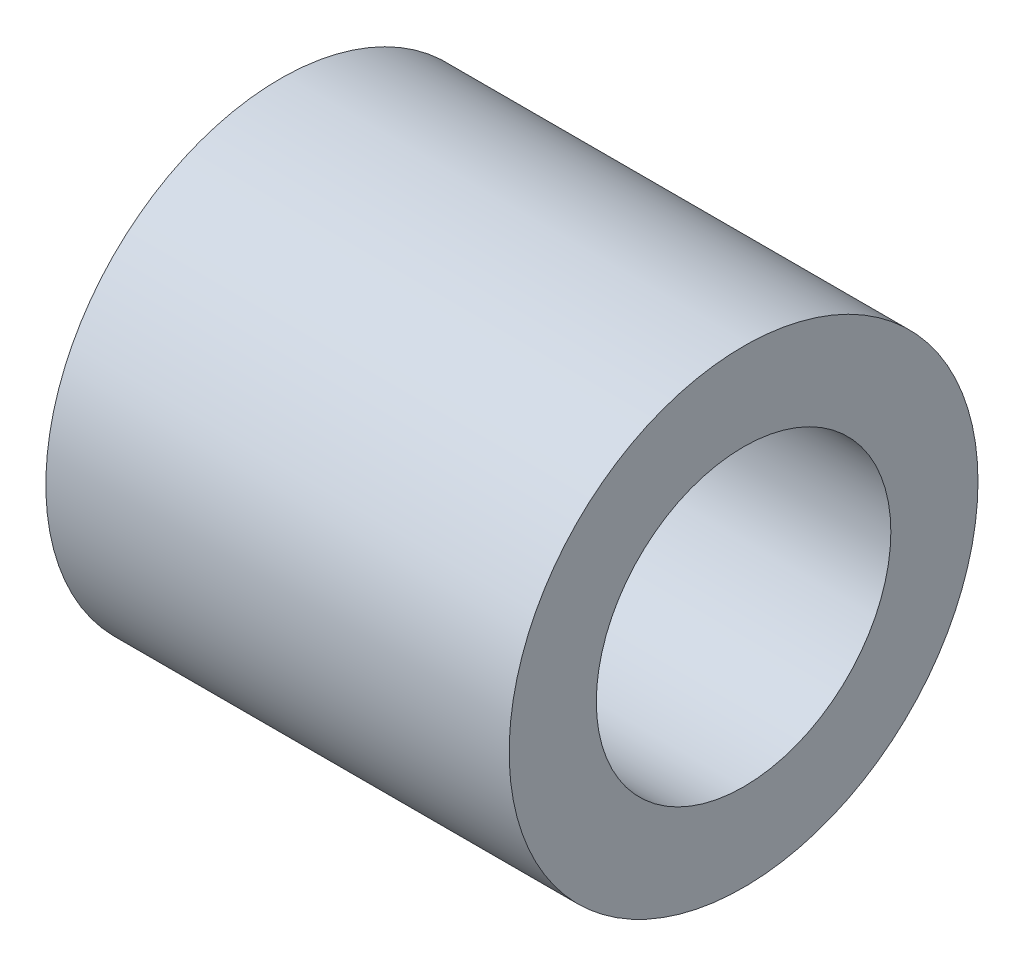
ISO-10303-21;
HEADER;
FILE_DESCRIPTION(('STEP AP214'),'2;1');
FILE_NAME('part.step','',(''),(''),'','','');
FILE_SCHEMA(('AUTOMOTIVE_DESIGN { 1 0 10303 214 1 1 1 1 }'));
ENDSEC;
DATA;
#1=APPLICATION_CONTEXT('core data for automotive mechanical design processes');
#2=APPLICATION_PROTOCOL_DEFINITION('international standard','automotive_design',2000,#1);
#3=PRODUCT_CONTEXT('',#1,'mechanical');
#4=PRODUCT('Part','Part','',(#3));
#5=PRODUCT_RELATED_PRODUCT_CATEGORY('part','',(#4));
#6=PRODUCT_DEFINITION_FORMATION('','',#4);
#7=PRODUCT_DEFINITION_CONTEXT('part definition',#1,'design');
#8=PRODUCT_DEFINITION('design','',#6,#7);
#9=PRODUCT_DEFINITION_SHAPE('','',#8);
#10=(LENGTH_UNIT() NAMED_UNIT(*) SI_UNIT(.MILLI.,.METRE.));
#11=(NAMED_UNIT(*) PLANE_ANGLE_UNIT() SI_UNIT($,.RADIAN.));
#12=(NAMED_UNIT(*) SI_UNIT($,.STERADIAN.) SOLID_ANGLE_UNIT());
#13=UNCERTAINTY_MEASURE_WITH_UNIT(LENGTH_MEASURE(1.E-05),#10,'distance_accuracy_value','');
#14=(GEOMETRIC_REPRESENTATION_CONTEXT(3) GLOBAL_UNCERTAINTY_ASSIGNED_CONTEXT((#13)) GLOBAL_UNIT_ASSIGNED_CONTEXT((#10,
#11,#12)) REPRESENTATION_CONTEXT('',''));
#15=CARTESIAN_POINT('',(0.,0.,0.));
#16=DIRECTION('',(0.,0.,1.));
#17=DIRECTION('',(1.,0.,0.));
#18=AXIS2_PLACEMENT_3D('',#15,#16,#17);
#19=CARTESIAN_POINT('',(10.668,0.,0.));
#20=DIRECTION('',(1.,0.,0.));
#21=DIRECTION('',(0.,0.,-1.));
#22=AXIS2_PLACEMENT_3D('',#19,#20,#21);
#23=PLANE('',#22);
#24=CARTESIAN_POINT('',(10.668,0.,0.));
#25=DIRECTION('',(1.,0.,0.));
#26=DIRECTION('',(0.,0.,-1.));
#27=AXIS2_PLACEMENT_3D('',#24,#25,#26);
#28=CIRCLE('',#27,5.3975);
#29=CARTESIAN_POINT('',(10.668,0.,-5.3975));
#30=VERTEX_POINT('',#29);
#31=EDGE_CURVE('E10',#30,#30,#28,.T.);
#32=ORIENTED_EDGE('',*,*,#31,.T.);
#33=EDGE_LOOP('',(#32));
#34=FACE_BOUND('',#33,.T.);
#35=CARTESIAN_POINT('',(10.668,0.,0.));
#36=DIRECTION('',(1.,0.,0.));
#37=DIRECTION('',(0.,0.,-1.));
#38=AXIS2_PLACEMENT_3D('',#35,#36,#37);
#39=CIRCLE('',#38,3.3909);
#40=CARTESIAN_POINT('',(10.668,0.,-3.3909));
#41=VERTEX_POINT('',#40);
#42=EDGE_CURVE('E56',#41,#41,#39,.T.);
#43=ORIENTED_EDGE('',*,*,#42,.F.);
#44=EDGE_LOOP('',(#43));
#45=FACE_BOUND('',#44,.T.);
#46=ADVANCED_FACE('F43',(#34,#45),#23,.T.);
#47=CARTESIAN_POINT('',(0.,0.,0.));
#48=DIRECTION('',(1.,0.,0.));
#49=DIRECTION('',(0.,0.,-1.));
#50=AXIS2_PLACEMENT_3D('',#47,#48,#49);
#51=PLANE('',#50);
#52=CARTESIAN_POINT('',(0.,0.,0.));
#53=DIRECTION('',(1.,0.,0.));
#54=DIRECTION('',(0.,0.,-1.));
#55=AXIS2_PLACEMENT_3D('',#52,#53,#54);
#56=CIRCLE('',#55,5.3975);
#57=CARTESIAN_POINT('',(0.,0.,-5.3975));
#58=VERTEX_POINT('',#57);
#59=EDGE_CURVE('E47',#58,#58,#56,.T.);
#60=ORIENTED_EDGE('',*,*,#59,.F.);
#61=EDGE_LOOP('',(#60));
#62=FACE_BOUND('',#61,.T.);
#63=CARTESIAN_POINT('',(0.,0.,0.));
#64=DIRECTION('',(1.,0.,0.));
#65=DIRECTION('',(0.,0.,-1.));
#66=AXIS2_PLACEMENT_3D('',#63,#64,#65);
#67=CIRCLE('',#66,3.3909);
#68=CARTESIAN_POINT('',(0.,0.,-3.3909));
#69=VERTEX_POINT('',#68);
#70=EDGE_CURVE('E58',#69,#69,#67,.T.);
#71=ORIENTED_EDGE('',*,*,#70,.T.);
#72=EDGE_LOOP('',(#71));
#73=FACE_BOUND('',#72,.T.);
#74=ADVANCED_FACE('F70',(#62,#73),#51,.F.);
#75=CARTESIAN_POINT('',(10.668,0.,0.));
#76=DIRECTION('',(-1.,0.,0.));
#77=DIRECTION('',(0.,0.,1.));
#78=AXIS2_PLACEMENT_3D('',#75,#76,#77);
#79=CYLINDRICAL_SURFACE('',#78,5.3975);
#80=ORIENTED_EDGE('',*,*,#31,.F.);
#81=EDGE_LOOP('',(#80));
#82=FACE_BOUND('',#81,.T.);
#83=ORIENTED_EDGE('',*,*,#59,.T.);
#84=EDGE_LOOP('',(#83));
#85=FACE_BOUND('',#84,.T.);
#86=ADVANCED_FACE('F45',(#82,#85),#79,.T.);
#87=CARTESIAN_POINT('',(10.668,0.,0.));
#88=DIRECTION('',(-1.,0.,0.));
#89=DIRECTION('',(0.,0.,1.));
#90=AXIS2_PLACEMENT_3D('',#87,#88,#89);
#91=CYLINDRICAL_SURFACE('',#90,3.3909);
#92=ORIENTED_EDGE('',*,*,#42,.T.);
#93=EDGE_LOOP('',(#92));
#94=FACE_BOUND('',#93,.T.);
#95=ORIENTED_EDGE('',*,*,#70,.F.);
#96=EDGE_LOOP('',(#95));
#97=FACE_BOUND('',#96,.T.);
#98=ADVANCED_FACE('F66',(#94,#97),#91,.F.);
#99=CLOSED_SHELL('',(#46,#74,#86,#98));
#100=MANIFOLD_SOLID_BREP('B2',#99);
#101=ADVANCED_BREP_SHAPE_REPRESENTATION('',(#18,#100),#14);
#102=SHAPE_DEFINITION_REPRESENTATION(#9,#101);
ENDSEC;
END-ISO-10303-21;
